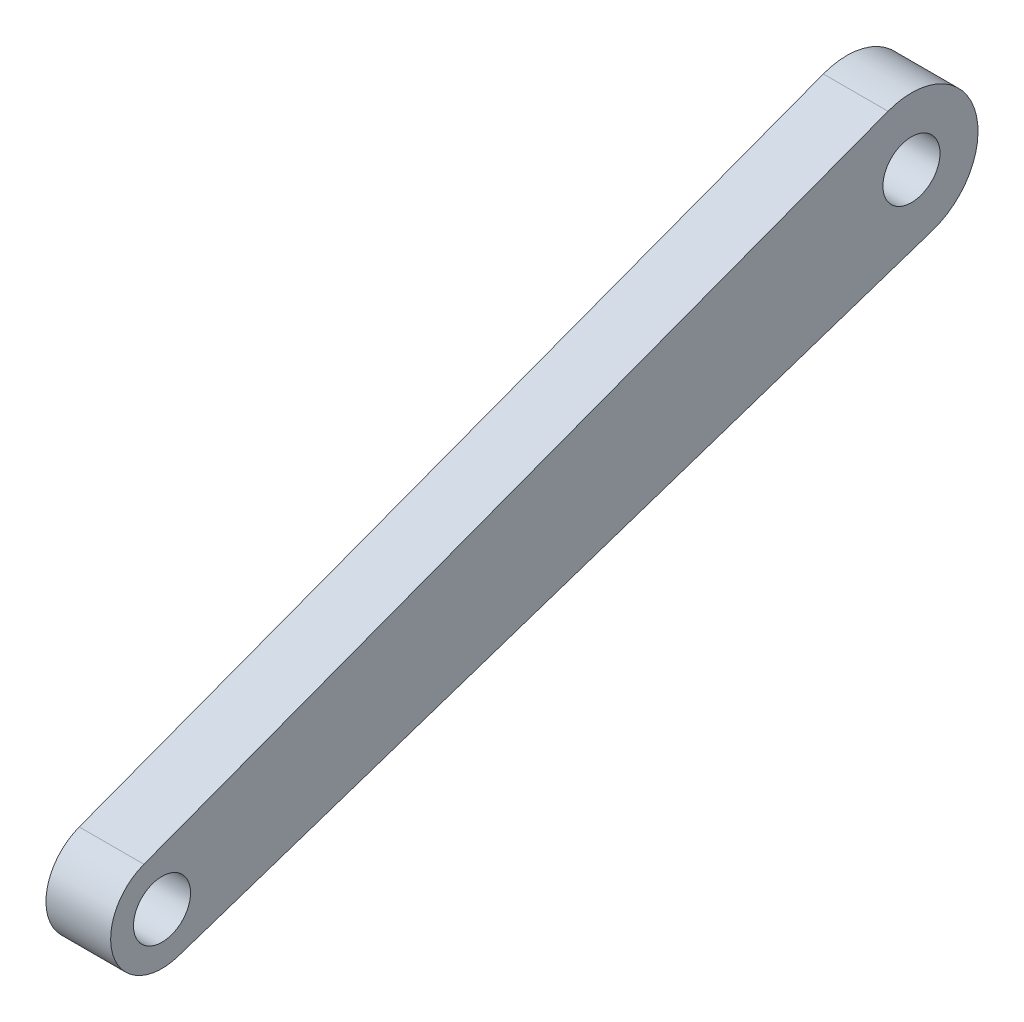
ISO-10303-21;
HEADER;
FILE_DESCRIPTION(('STEP AP214'),'2;1');
FILE_NAME('part.step','',(''),(''),'','','');
FILE_SCHEMA(('AUTOMOTIVE_DESIGN { 1 0 10303 214 1 1 1 1 }'));
ENDSEC;
DATA;
#1=APPLICATION_CONTEXT('core data for automotive mechanical design processes');
#2=APPLICATION_PROTOCOL_DEFINITION('international standard','automotive_design',2000,#1);
#3=PRODUCT_CONTEXT('',#1,'mechanical');
#4=PRODUCT('Part','Part','',(#3));
#5=PRODUCT_RELATED_PRODUCT_CATEGORY('part','',(#4));
#6=PRODUCT_DEFINITION_FORMATION('','',#4);
#7=PRODUCT_DEFINITION_CONTEXT('part definition',#1,'design');
#8=PRODUCT_DEFINITION('design','',#6,#7);
#9=PRODUCT_DEFINITION_SHAPE('','',#8);
#10=(LENGTH_UNIT() NAMED_UNIT(*) SI_UNIT(.MILLI.,.METRE.));
#11=(NAMED_UNIT(*) PLANE_ANGLE_UNIT() SI_UNIT($,.RADIAN.));
#12=(NAMED_UNIT(*) SI_UNIT($,.STERADIAN.) SOLID_ANGLE_UNIT());
#13=UNCERTAINTY_MEASURE_WITH_UNIT(LENGTH_MEASURE(1.E-05),#10,'distance_accuracy_value','');
#14=(GEOMETRIC_REPRESENTATION_CONTEXT(3) GLOBAL_UNCERTAINTY_ASSIGNED_CONTEXT((#13)) GLOBAL_UNIT_ASSIGNED_CONTEXT((#10,
#11,#12)) REPRESENTATION_CONTEXT('',''));
#15=CARTESIAN_POINT('',(0.,0.,0.));
#16=DIRECTION('',(0.,0.,1.));
#17=DIRECTION('',(1.,0.,0.));
#18=AXIS2_PLACEMENT_3D('',#15,#16,#17);
#19=CARTESIAN_POINT('',(-1.7,-2.77422213102875,-1.0440346999814));
#20=DIRECTION('',(0.,-0.935918001733899,-0.352217963809947));
#21=DIRECTION('',(0.,0.352217963809947,-0.935918001733899));
#22=AXIS2_PLACEMENT_3D('',#19,#20,#21);
#23=PLANE('',#22);
#24=DIRECTION('',(1.,0.,0.));
#25=VECTOR('',#24,1.);
#26=CARTESIAN_POINT('',(-1.7,-1.65114085828097,-4.02830037798651));
#27=LINE('',#26,#25);
#28=CARTESIAN_POINT('',(-1.7,-1.65114085828097,-4.02830037798651));
#29=VERTEX_POINT('',#28);
#30=CARTESIAN_POINT('',(1.7,-1.65114085828097,-4.02830037798651));
#31=VERTEX_POINT('',#30);
#32=EDGE_CURVE('E44',#29,#31,#27,.T.);
#33=ORIENTED_EDGE('',*,*,#32,.T.);
#34=DIRECTION('',(0.,0.352217963809947,-0.935918001733899));
#35=VECTOR('',#34,1.);
#36=CARTESIAN_POINT('',(1.7,-2.77422213102875,-1.0440346999814));
#37=LINE('',#36,#35);
#38=CARTESIAN_POINT('',(1.7,13.0725350538389,-43.1522371266653));
#39=VERTEX_POINT('',#38);
#40=EDGE_CURVE('E85',#31,#39,#37,.T.);
#41=ORIENTED_EDGE('',*,*,#40,.T.);
#42=DIRECTION('',(1.,0.,0.));
#43=VECTOR('',#42,1.);
#44=CARTESIAN_POINT('',(-1.7,13.0725350538389,-43.1522371266653));
#45=LINE('',#44,#43);
#46=CARTESIAN_POINT('',(-1.7,13.0725350538389,-43.1522371266653));
#47=VERTEX_POINT('',#46);
#48=EDGE_CURVE('E11',#47,#39,#45,.T.);
#49=ORIENTED_EDGE('',*,*,#48,.F.);
#50=DIRECTION('',(0.,0.352217963809947,-0.935918001733899));
#51=VECTOR('',#50,1.);
#52=CARTESIAN_POINT('',(-1.7,-2.77422213102875,-1.0440346999814));
#53=LINE('',#52,#51);
#54=EDGE_CURVE('E57',#29,#47,#53,.T.);
#55=ORIENTED_EDGE('',*,*,#54,.F.);
#56=EDGE_LOOP('',(#33,#41,#49,#55));
#57=FACE_BOUND('',#56,.T.);
#58=ADVANCED_FACE('F41',(#57),#23,.F.);
#59=CARTESIAN_POINT('',(-1.7,9.79682204777028,-44.3850000000001));
#60=DIRECTION('',(1.,0.,0.));
#61=DIRECTION('',(0.,0.,-1.));
#62=AXIS2_PLACEMENT_3D('',#59,#60,#61);
#63=CYLINDRICAL_SURFACE('',#62,3.49999999999999);
#64=ORIENTED_EDGE('',*,*,#48,.T.);
#65=CARTESIAN_POINT('',(1.7,9.79682204777028,-44.3850000000001));
#66=DIRECTION('',(1.,0.,0.));
#67=DIRECTION('',(0.,0.,-1.));
#68=AXIS2_PLACEMENT_3D('',#65,#66,#67);
#69=CIRCLE('',#68,3.49999999999999);
#70=CARTESIAN_POINT('',(1.7,6.47634085515537,-45.4915281964283));
#71=VERTEX_POINT('',#70);
#72=EDGE_CURVE('E102',#71,#39,#69,.T.);
#73=ORIENTED_EDGE('',*,*,#72,.F.);
#74=DIRECTION('',(1.,0.,0.));
#75=VECTOR('',#74,1.);
#76=CARTESIAN_POINT('',(-1.7,6.47634085515537,-45.4915281964283));
#77=LINE('',#76,#75);
#78=CARTESIAN_POINT('',(-1.7,6.47634085515537,-45.4915281964283));
#79=VERTEX_POINT('',#78);
#80=EDGE_CURVE('E49',#79,#71,#77,.T.);
#81=ORIENTED_EDGE('',*,*,#80,.F.);
#82=CARTESIAN_POINT('',(-1.7,9.79682204777028,-44.3850000000001));
#83=DIRECTION('',(1.,0.,0.));
#84=DIRECTION('',(0.,0.,-1.));
#85=AXIS2_PLACEMENT_3D('',#82,#83,#84);
#86=CIRCLE('',#85,3.49999999999999);
#87=EDGE_CURVE('E118',#79,#47,#86,.T.);
#88=ORIENTED_EDGE('',*,*,#87,.T.);
#89=EDGE_LOOP('',(#64,#73,#81,#88));
#90=FACE_BOUND('',#89,.T.);
#91=ADVANCED_FACE('F127',(#90),#63,.T.);
#92=CARTESIAN_POINT('',(-1.7,-7.81548858774636,-2.60445941101496));
#93=DIRECTION('',(0.,0.94870891217569,0.316150913265198));
#94=DIRECTION('',(0.,-0.316150913265198,0.94870891217569));
#95=AXIS2_PLACEMENT_3D('',#92,#93,#94);
#96=PLANE('',#95);
#97=ORIENTED_EDGE('',*,*,#80,.T.);
#98=DIRECTION('',(0.,-0.316150913265198,0.94870891217569));
#99=VECTOR('',#98,1.);
#100=CARTESIAN_POINT('',(1.7,-7.81548858774636,-2.60445941101496));
#101=LINE('',#100,#99);
#102=CARTESIAN_POINT('',(1.7,-6.73963352583686,-5.8328963460894));
#103=VERTEX_POINT('',#102);
#104=EDGE_CURVE('E97',#71,#103,#101,.T.);
#105=ORIENTED_EDGE('',*,*,#104,.T.);
#106=DIRECTION('',(1.,0.,0.));
#107=VECTOR('',#106,1.);
#108=CARTESIAN_POINT('',(-1.7,-6.73963352583686,-5.8328963460894));
#109=LINE('',#108,#107);
#110=CARTESIAN_POINT('',(-1.7,-6.73963352583686,-5.8328963460894));
#111=VERTEX_POINT('',#110);
#112=EDGE_CURVE('E88',#111,#103,#109,.T.);
#113=ORIENTED_EDGE('',*,*,#112,.F.);
#114=DIRECTION('',(0.,-0.316150913265198,0.94870891217569));
#115=VECTOR('',#114,1.);
#116=CARTESIAN_POINT('',(-1.7,-7.81548858774636,-2.60445941101496));
#117=LINE('',#116,#115);
#118=EDGE_CURVE('E116',#79,#111,#117,.T.);
#119=ORIENTED_EDGE('',*,*,#118,.F.);
#120=EDGE_LOOP('',(#97,#105,#113,#119));
#121=FACE_BOUND('',#120,.T.);
#122=ADVANCED_FACE('F126',(#121),#96,.F.);
#123=CARTESIAN_POINT('',(-1.7,9.79682204777028,-44.3850000000001));
#124=DIRECTION('',(1.,0.,0.));
#125=DIRECTION('',(0.,0.,-1.));
#126=AXIS2_PLACEMENT_3D('',#123,#124,#125);
#127=CYLINDRICAL_SURFACE('',#126,1.5);
#128=CARTESIAN_POINT('',(-1.7,9.79682204777028,-44.3850000000001));
#129=DIRECTION('',(1.,0.,0.));
#130=DIRECTION('',(0.,0.,-1.));
#131=AXIS2_PLACEMENT_3D('',#128,#129,#130);
#132=CIRCLE('',#131,1.5);
#133=CARTESIAN_POINT('',(-1.7,9.79682204777028,-45.8850000000001));
#134=VERTEX_POINT('',#133);
#135=EDGE_CURVE('E120',#134,#134,#132,.T.);
#136=ORIENTED_EDGE('',*,*,#135,.F.);
#137=EDGE_LOOP('',(#136));
#138=FACE_BOUND('',#137,.T.);
#139=CARTESIAN_POINT('',(1.7,9.79682204777028,-44.3850000000001));
#140=DIRECTION('',(1.,0.,0.));
#141=DIRECTION('',(0.,0.,-1.));
#142=AXIS2_PLACEMENT_3D('',#139,#140,#141);
#143=CIRCLE('',#142,1.5);
#144=CARTESIAN_POINT('',(1.7,9.79682204777028,-45.8850000000001));
#145=VERTEX_POINT('',#144);
#146=EDGE_CURVE('E107',#145,#145,#143,.T.);
#147=ORIENTED_EDGE('',*,*,#146,.T.);
#148=EDGE_LOOP('',(#147));
#149=FACE_BOUND('',#148,.T.);
#150=ADVANCED_FACE('F154',(#138,#149),#127,.F.);
#151=CARTESIAN_POINT('',(-1.7,-4.1781194629625,-4.97928888027337));
#152=DIRECTION('',(1.,0.,0.));
#153=DIRECTION('',(0.,0.,-1.));
#154=AXIS2_PLACEMENT_3D('',#151,#152,#153);
#155=CYLINDRICAL_SURFACE('',#154,2.7);
#156=ORIENTED_EDGE('',*,*,#112,.T.);
#157=CARTESIAN_POINT('',(1.7,-4.1781194629625,-4.97928888027337));
#158=DIRECTION('',(1.,0.,0.));
#159=DIRECTION('',(0.,0.,-1.));
#160=AXIS2_PLACEMENT_3D('',#157,#158,#159);
#161=CIRCLE('',#160,2.7);
#162=EDGE_CURVE('E91',#31,#103,#161,.T.);
#163=ORIENTED_EDGE('',*,*,#162,.F.);
#164=ORIENTED_EDGE('',*,*,#32,.F.);
#165=CARTESIAN_POINT('',(-1.7,-4.1781194629625,-4.97928888027337));
#166=DIRECTION('',(1.,0.,0.));
#167=DIRECTION('',(0.,0.,-1.));
#168=AXIS2_PLACEMENT_3D('',#165,#166,#167);
#169=CIRCLE('',#168,2.7);
#170=EDGE_CURVE('E114',#29,#111,#169,.T.);
#171=ORIENTED_EDGE('',*,*,#170,.T.);
#172=EDGE_LOOP('',(#156,#163,#164,#171));
#173=FACE_BOUND('',#172,.T.);
#174=ADVANCED_FACE('F92',(#173),#155,.T.);
#175=CARTESIAN_POINT('',(-1.7,-4.1781194629625,-4.97928888027337));
#176=DIRECTION('',(1.,0.,0.));
#177=DIRECTION('',(0.,0.,-1.));
#178=AXIS2_PLACEMENT_3D('',#175,#176,#177);
#179=CYLINDRICAL_SURFACE('',#178,1.5);
#180=CARTESIAN_POINT('',(-1.7,-4.1781194629625,-4.97928888027337));
#181=DIRECTION('',(1.,0.,0.));
#182=DIRECTION('',(0.,0.,-1.));
#183=AXIS2_PLACEMENT_3D('',#180,#181,#182);
#184=CIRCLE('',#183,1.5);
#185=CARTESIAN_POINT('',(-1.7,-4.1781194629625,-6.47928888027337));
#186=VERTEX_POINT('',#185);
#187=EDGE_CURVE('E89',#186,#186,#184,.T.);
#188=ORIENTED_EDGE('',*,*,#187,.F.);
#189=EDGE_LOOP('',(#188));
#190=FACE_BOUND('',#189,.T.);
#191=CARTESIAN_POINT('',(1.7,-4.1781194629625,-4.97928888027337));
#192=DIRECTION('',(1.,0.,0.));
#193=DIRECTION('',(0.,0.,-1.));
#194=AXIS2_PLACEMENT_3D('',#191,#192,#193);
#195=CIRCLE('',#194,1.5);
#196=CARTESIAN_POINT('',(1.7,-4.1781194629625,-6.47928888027337));
#197=VERTEX_POINT('',#196);
#198=EDGE_CURVE('E110',#197,#197,#195,.T.);
#199=ORIENTED_EDGE('',*,*,#198,.T.);
#200=EDGE_LOOP('',(#199));
#201=FACE_BOUND('',#200,.T.);
#202=ADVANCED_FACE('F131',(#190,#201),#179,.F.);
#203=CARTESIAN_POINT('',(-1.7,0.,0.));
#204=DIRECTION('',(1.,0.,0.));
#205=DIRECTION('',(0.,0.,-1.));
#206=AXIS2_PLACEMENT_3D('',#203,#204,#205);
#207=PLANE('',#206);
#208=ORIENTED_EDGE('',*,*,#54,.T.);
#209=ORIENTED_EDGE('',*,*,#87,.F.);
#210=ORIENTED_EDGE('',*,*,#118,.T.);
#211=ORIENTED_EDGE('',*,*,#170,.F.);
#212=EDGE_LOOP('',(#208,#209,#210,#211));
#213=FACE_BOUND('',#212,.T.);
#214=ORIENTED_EDGE('',*,*,#135,.T.);
#215=EDGE_LOOP('',(#214));
#216=FACE_BOUND('',#215,.T.);
#217=ORIENTED_EDGE('',*,*,#187,.T.);
#218=EDGE_LOOP('',(#217));
#219=FACE_BOUND('',#218,.T.);
#220=ADVANCED_FACE('F128',(#213,#216,#219),#207,.F.);
#221=CARTESIAN_POINT('',(1.7,0.,0.));
#222=DIRECTION('',(1.,0.,0.));
#223=DIRECTION('',(0.,0.,-1.));
#224=AXIS2_PLACEMENT_3D('',#221,#222,#223);
#225=PLANE('',#224);
#226=ORIENTED_EDGE('',*,*,#40,.F.);
#227=ORIENTED_EDGE('',*,*,#162,.T.);
#228=ORIENTED_EDGE('',*,*,#104,.F.);
#229=ORIENTED_EDGE('',*,*,#72,.T.);
#230=EDGE_LOOP('',(#226,#227,#228,#229));
#231=FACE_BOUND('',#230,.T.);
#232=ORIENTED_EDGE('',*,*,#146,.F.);
#233=EDGE_LOOP('',(#232));
#234=FACE_BOUND('',#233,.T.);
#235=ORIENTED_EDGE('',*,*,#198,.F.);
#236=EDGE_LOOP('',(#235));
#237=FACE_BOUND('',#236,.T.);
#238=ADVANCED_FACE('F100',(#231,#234,#237),#225,.T.);
#239=CLOSED_SHELL('',(#58,#91,#122,#150,#174,#202,#220,#238));
#240=MANIFOLD_SOLID_BREP('B2',#239);
#241=ADVANCED_BREP_SHAPE_REPRESENTATION('',(#18,#240),#14);
#242=SHAPE_DEFINITION_REPRESENTATION(#9,#241);
ENDSEC;
END-ISO-10303-21;
